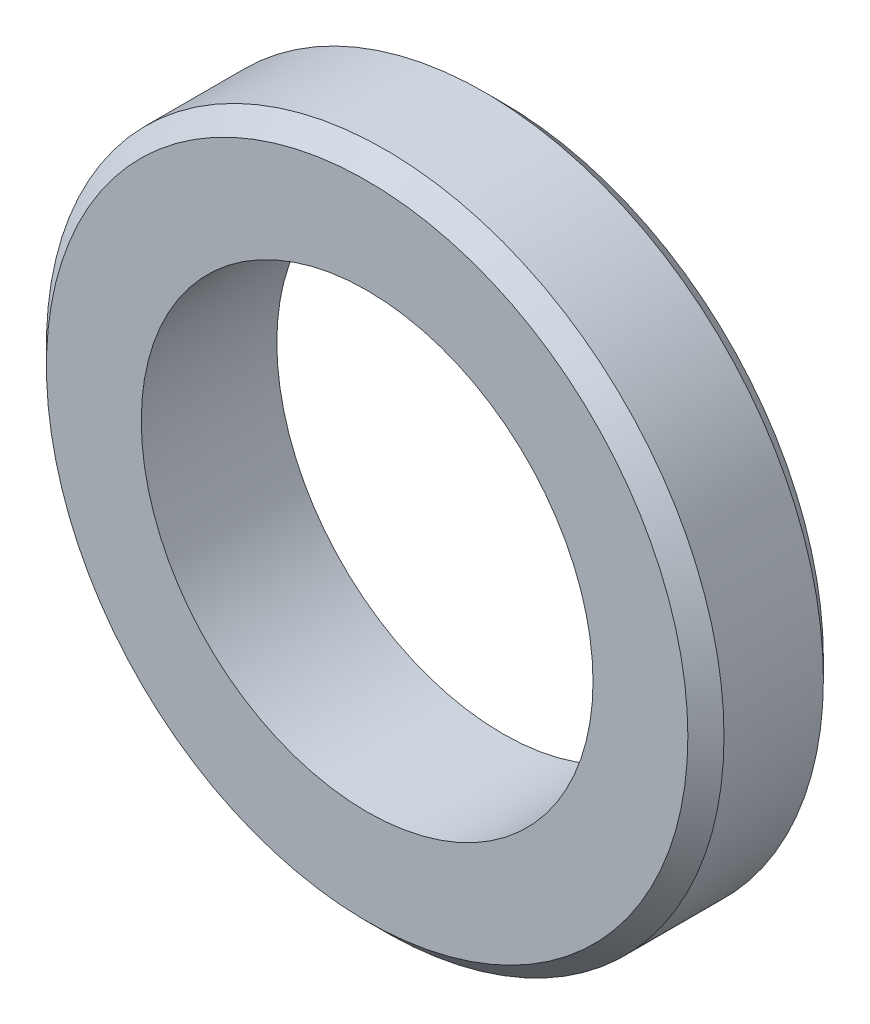
ISO-10303-21;
HEADER;
FILE_DESCRIPTION(('STEP AP214'),'2;1');
FILE_NAME('part.step','',(''),(''),'','','');
FILE_SCHEMA(('AUTOMOTIVE_DESIGN { 1 0 10303 214 1 1 1 1 }'));
ENDSEC;
DATA;
#1=APPLICATION_CONTEXT('core data for automotive mechanical design processes');
#2=APPLICATION_PROTOCOL_DEFINITION('international standard','automotive_design',2000,#1);
#3=PRODUCT_CONTEXT('',#1,'mechanical');
#4=PRODUCT('Part','Part','',(#3));
#5=PRODUCT_RELATED_PRODUCT_CATEGORY('part','',(#4));
#6=PRODUCT_DEFINITION_FORMATION('','',#4);
#7=PRODUCT_DEFINITION_CONTEXT('part definition',#1,'design');
#8=PRODUCT_DEFINITION('design','',#6,#7);
#9=PRODUCT_DEFINITION_SHAPE('','',#8);
#10=(LENGTH_UNIT() NAMED_UNIT(*) SI_UNIT(.MILLI.,.METRE.));
#11=(NAMED_UNIT(*) PLANE_ANGLE_UNIT() SI_UNIT($,.RADIAN.));
#12=(NAMED_UNIT(*) SI_UNIT($,.STERADIAN.) SOLID_ANGLE_UNIT());
#13=UNCERTAINTY_MEASURE_WITH_UNIT(LENGTH_MEASURE(1.E-05),#10,'distance_accuracy_value','');
#14=(GEOMETRIC_REPRESENTATION_CONTEXT(3) GLOBAL_UNCERTAINTY_ASSIGNED_CONTEXT((#13)) GLOBAL_UNIT_ASSIGNED_CONTEXT((#10,
#11,#12)) REPRESENTATION_CONTEXT('',''));
#15=CARTESIAN_POINT('',(0.,0.,0.));
#16=DIRECTION('',(0.,0.,1.));
#17=DIRECTION('',(1.,0.,0.));
#18=AXIS2_PLACEMENT_3D('',#15,#16,#17);
#19=CARTESIAN_POINT('',(0.,0.,3.));
#20=DIRECTION('',(0.,0.,1.));
#21=DIRECTION('',(1.,0.,0.));
#22=AXIS2_PLACEMENT_3D('',#19,#20,#21);
#23=PLANE('',#22);
#24=CARTESIAN_POINT('',(0.,0.,3.));
#25=DIRECTION('',(0.,0.,1.));
#26=DIRECTION('',(1.,0.,0.));
#27=AXIS2_PLACEMENT_3D('',#24,#25,#26);
#28=CIRCLE('',#27,7.1);
#29=CARTESIAN_POINT('',(7.1,0.,3.));
#30=VERTEX_POINT('',#29);
#31=EDGE_CURVE('E10',#30,#30,#28,.T.);
#32=ORIENTED_EDGE('',*,*,#31,.T.);
#33=EDGE_LOOP('',(#32));
#34=FACE_BOUND('',#33,.T.);
#35=CARTESIAN_POINT('',(0.,0.,3.));
#36=DIRECTION('',(0.,0.,1.));
#37=DIRECTION('',(1.,0.,0.));
#38=AXIS2_PLACEMENT_3D('',#35,#36,#37);
#39=CIRCLE('',#38,5.);
#40=CARTESIAN_POINT('',(5.,0.,3.));
#41=VERTEX_POINT('',#40);
#42=EDGE_CURVE('E69',#41,#41,#39,.T.);
#43=ORIENTED_EDGE('',*,*,#42,.F.);
#44=EDGE_LOOP('',(#43));
#45=FACE_BOUND('',#44,.T.);
#46=ADVANCED_FACE('F44',(#34,#45),#23,.T.);
#47=CARTESIAN_POINT('',(0.,0.,0.));
#48=DIRECTION('',(0.,0.,1.));
#49=DIRECTION('',(1.,0.,0.));
#50=AXIS2_PLACEMENT_3D('',#47,#48,#49);
#51=PLANE('',#50);
#52=CARTESIAN_POINT('',(0.,0.,0.));
#53=DIRECTION('',(0.,0.,1.));
#54=DIRECTION('',(1.,0.,0.));
#55=AXIS2_PLACEMENT_3D('',#52,#53,#54);
#56=CIRCLE('',#55,7.1);
#57=CARTESIAN_POINT('',(7.1,0.,0.));
#58=VERTEX_POINT('',#57);
#59=EDGE_CURVE('E53',#58,#58,#56,.F.);
#60=ORIENTED_EDGE('',*,*,#59,.T.);
#61=EDGE_LOOP('',(#60));
#62=FACE_BOUND('',#61,.T.);
#63=CARTESIAN_POINT('',(0.,0.,0.));
#64=DIRECTION('',(0.,0.,1.));
#65=DIRECTION('',(1.,0.,0.));
#66=AXIS2_PLACEMENT_3D('',#63,#64,#65);
#67=CIRCLE('',#66,5.);
#68=CARTESIAN_POINT('',(5.,0.,0.));
#69=VERTEX_POINT('',#68);
#70=EDGE_CURVE('E70',#69,#69,#67,.T.);
#71=ORIENTED_EDGE('',*,*,#70,.T.);
#72=EDGE_LOOP('',(#71));
#73=FACE_BOUND('',#72,.T.);
#74=ADVANCED_FACE('F82',(#62,#73),#51,.F.);
#75=CARTESIAN_POINT('',(0.,0.,3.));
#76=DIRECTION('',(0.,0.,-1.));
#77=DIRECTION('',(-1.,0.,0.));
#78=AXIS2_PLACEMENT_3D('',#75,#76,#77);
#79=CYLINDRICAL_SURFACE('',#78,7.5);
#80=CARTESIAN_POINT('',(0.,0.,0.399999999999998));
#81=DIRECTION('',(0.,0.,1.));
#82=DIRECTION('',(1.,0.,0.));
#83=AXIS2_PLACEMENT_3D('',#80,#81,#82);
#84=CIRCLE('',#83,7.5);
#85=CARTESIAN_POINT('',(7.5,0.,0.399999999999998));
#86=VERTEX_POINT('',#85);
#87=EDGE_CURVE('E58',#86,#86,#84,.T.);
#88=ORIENTED_EDGE('',*,*,#87,.T.);
#89=EDGE_LOOP('',(#88));
#90=FACE_BOUND('',#89,.T.);
#91=CARTESIAN_POINT('',(0.,0.,2.6));
#92=DIRECTION('',(0.,0.,1.));
#93=DIRECTION('',(1.,0.,0.));
#94=AXIS2_PLACEMENT_3D('',#91,#92,#93);
#95=CIRCLE('',#94,7.5);
#96=CARTESIAN_POINT('',(7.5,0.,2.6));
#97=VERTEX_POINT('',#96);
#98=EDGE_CURVE('E63',#97,#97,#95,.F.);
#99=ORIENTED_EDGE('',*,*,#98,.T.);
#100=EDGE_LOOP('',(#99));
#101=FACE_BOUND('',#100,.T.);
#102=ADVANCED_FACE('F88',(#90,#101),#79,.T.);
#103=CARTESIAN_POINT('',(0.,0.,3.));
#104=DIRECTION('',(0.,0.,-1.));
#105=DIRECTION('',(-1.,0.,0.));
#106=AXIS2_PLACEMENT_3D('',#103,#104,#105);
#107=CYLINDRICAL_SURFACE('',#106,5.);
#108=ORIENTED_EDGE('',*,*,#42,.T.);
#109=EDGE_LOOP('',(#108));
#110=FACE_BOUND('',#109,.T.);
#111=ORIENTED_EDGE('',*,*,#70,.F.);
#112=EDGE_LOOP('',(#111));
#113=FACE_BOUND('',#112,.T.);
#114=ADVANCED_FACE('F78',(#110,#113),#107,.F.);
#115=CARTESIAN_POINT('',(0.,0.,0.399999999999998));
#116=DIRECTION('',(0.,0.,1.));
#117=DIRECTION('',(1.,0.,0.));
#118=AXIS2_PLACEMENT_3D('',#115,#116,#117);
#119=CONICAL_SURFACE('',#118,7.5,0.78539816339745);
#120=CARTESIAN_POINT('',(7.1,0.,0.));
#121=CARTESIAN_POINT('',(7.10416666666667,0.,0.00416666666666638));
#122=CARTESIAN_POINT('',(7.10833333333333,0.,0.00833333333333312));
#123=CARTESIAN_POINT('',(7.11666666666667,0.,0.0166666666666666));
#124=CARTESIAN_POINT('',(7.12083333333333,0.,0.0208333333333333));
#125=CARTESIAN_POINT('',(7.12916666666667,0.,0.0291666666666666));
#126=CARTESIAN_POINT('',(7.13333333333333,0.,0.0333333333333331));
#127=CARTESIAN_POINT('',(7.14166666666667,0.,0.0416666666666664));
#128=CARTESIAN_POINT('',(7.14583333333333,0.,0.0458333333333332));
#129=CARTESIAN_POINT('',(7.15416666666667,0.,0.0541666666666665));
#130=CARTESIAN_POINT('',(7.15833333333333,0.,0.058333333333333));
#131=CARTESIAN_POINT('',(7.16666666666667,0.,0.0666666666666663));
#132=CARTESIAN_POINT('',(7.17083333333333,0.,0.0708333333333331));
#133=CARTESIAN_POINT('',(7.17916666666667,0.,0.0791666666666664));
#134=CARTESIAN_POINT('',(7.18333333333333,0.,0.083333333333333));
#135=CARTESIAN_POINT('',(7.19166666666667,0.,0.0916666666666662));
#136=CARTESIAN_POINT('',(7.19583333333333,0.,0.0958333333333328));
#137=CARTESIAN_POINT('',(7.20416666666667,0.,0.104166666666666));
#138=CARTESIAN_POINT('',(7.20833333333333,0.,0.108333333333333));
#139=CARTESIAN_POINT('',(7.21666666666667,0.,0.116666666666666));
#140=CARTESIAN_POINT('',(7.22083333333333,0.,0.120833333333333));
#141=CARTESIAN_POINT('',(7.22916666666667,0.,0.129166666666666));
#142=CARTESIAN_POINT('',(7.23333333333333,0.,0.133333333333333));
#143=CARTESIAN_POINT('',(7.24166666666667,0.,0.141666666666666));
#144=CARTESIAN_POINT('',(7.24583333333333,0.,0.145833333333333));
#145=CARTESIAN_POINT('',(7.25416666666667,0.,0.154166666666666));
#146=CARTESIAN_POINT('',(7.25833333333333,0.,0.158333333333333));
#147=CARTESIAN_POINT('',(7.26666666666667,0.,0.166666666666666));
#148=CARTESIAN_POINT('',(7.27083333333333,0.,0.170833333333333));
#149=CARTESIAN_POINT('',(7.27916666666667,0.,0.179166666666666));
#150=CARTESIAN_POINT('',(7.28333333333333,0.,0.183333333333332));
#151=CARTESIAN_POINT('',(7.29166666666667,0.,0.191666666666666));
#152=CARTESIAN_POINT('',(7.29583333333333,0.,0.195833333333333));
#153=CARTESIAN_POINT('',(7.30416666666667,0.,0.204166666666666));
#154=CARTESIAN_POINT('',(7.30833333333333,0.,0.208333333333333));
#155=CARTESIAN_POINT('',(7.31666666666667,0.,0.216666666666666));
#156=CARTESIAN_POINT('',(7.32083333333333,0.,0.220833333333332));
#157=CARTESIAN_POINT('',(7.32916666666667,0.,0.229166666666666));
#158=CARTESIAN_POINT('',(7.33333333333333,0.,0.233333333333332));
#159=CARTESIAN_POINT('',(7.34166666666667,0.,0.241666666666666));
#160=CARTESIAN_POINT('',(7.34583333333333,0.,0.245833333333332));
#161=CARTESIAN_POINT('',(7.35416666666667,0.,0.254166666666666));
#162=CARTESIAN_POINT('',(7.35833333333333,0.,0.258333333333332));
#163=CARTESIAN_POINT('',(7.36666666666667,0.,0.266666666666666));
#164=CARTESIAN_POINT('',(7.37083333333333,0.,0.270833333333332));
#165=CARTESIAN_POINT('',(7.37916666666667,0.,0.279166666666665));
#166=CARTESIAN_POINT('',(7.38333333333333,0.,0.283333333333332));
#167=CARTESIAN_POINT('',(7.39166666666667,0.,0.291666666666665));
#168=CARTESIAN_POINT('',(7.39583333333333,0.,0.295833333333332));
#169=CARTESIAN_POINT('',(7.40416666666667,0.,0.304166666666665));
#170=CARTESIAN_POINT('',(7.40833333333333,0.,0.308333333333332));
#171=CARTESIAN_POINT('',(7.41666666666667,0.,0.316666666666665));
#172=CARTESIAN_POINT('',(7.42083333333333,0.,0.320833333333332));
#173=CARTESIAN_POINT('',(7.42916666666667,0.,0.329166666666665));
#174=CARTESIAN_POINT('',(7.43333333333333,0.,0.333333333333332));
#175=CARTESIAN_POINT('',(7.44166666666667,0.,0.341666666666665));
#176=CARTESIAN_POINT('',(7.44583333333333,0.,0.345833333333332));
#177=CARTESIAN_POINT('',(7.45416666666667,0.,0.354166666666665));
#178=CARTESIAN_POINT('',(7.45833333333333,0.,0.358333333333332));
#179=CARTESIAN_POINT('',(7.46666666666667,0.,0.366666666666665));
#180=CARTESIAN_POINT('',(7.47083333333333,0.,0.370833333333332));
#181=CARTESIAN_POINT('',(7.47916666666667,0.,0.379166666666665));
#182=CARTESIAN_POINT('',(7.48333333333333,0.,0.383333333333332));
#183=CARTESIAN_POINT('',(7.49166666666667,0.,0.391666666666665));
#184=CARTESIAN_POINT('',(7.49583333333333,0.,0.395833333333332));
#185=CARTESIAN_POINT('',(7.5,0.,0.399999999999998));
#186=B_SPLINE_CURVE_WITH_KNOTS('',3,(#120,#121,#122,#123,#124,#125,#126,#127,#128,#129,#130,
#131,#132,#133,#134,#135,#136,#137,#138,#139,#140,#141,#142,#143,#144,#145,#146,#147,#148,#149,
#150,#151,#152,#153,#154,#155,#156,#157,#158,#159,#160,#161,#162,#163,#164,#165,#166,#167,#168,
#169,#170,#171,#172,#173,#174,#175,#176,#177,#178,#179,#180,#181,#182,#183,#184,#185),
.UNSPECIFIED.,.F.,.F.,(4,2,2,2,2,2,2,2,2,2,2,2,2,2,2,2,2,2,2,2,2,2,2,2,2,2,2,2,2,2,2,2,4),(0.,
0.0176776695296639,0.0353553390593272,0.0530330085889911,0.0707106781186544,0.0883883476483183,
0.106066017177982,0.123743686707646,0.141421356237309,0.159099025766973,0.176776695296637,
0.1944543648263,0.212132034355964,0.229809703885628,0.247487373415291,0.265165042944955,
0.282842712474618,0.300520382004282,0.318198051533946,0.335875721063609,0.353553390593273,
0.371231060122937,0.3889087296526,0.406586399182264,0.424264068711928,0.441941738241592,
0.459619407771255,0.477297077300919,0.494974746830583,0.512652416360246,0.53033008588991,
0.548007755419573,0.565685424949237),.UNSPECIFIED.);
#187=EDGE_CURVE('BSEAM95',#58,#86,#186,.T.);
#188=ORIENTED_EDGE('',*,*,#59,.F.);
#189=ORIENTED_EDGE('',*,*,#87,.F.);
#190=ORIENTED_EDGE('',*,*,#187,.T.);
#191=ORIENTED_EDGE('',*,*,#187,.F.);
#192=EDGE_LOOP('',(#188,#190,#189,#191));
#193=FACE_BOUND('',#192,.T.);
#194=ADVANCED_FACE('F95',(#193),#119,.T.);
#195=CARTESIAN_POINT('',(0.,0.,3.));
#196=DIRECTION('',(0.,0.,-1.));
#197=DIRECTION('',(-1.,0.,0.));
#198=AXIS2_PLACEMENT_3D('',#195,#196,#197);
#199=CONICAL_SURFACE('',#198,7.1,0.785398163397448);
#200=ORIENTED_EDGE('',*,*,#98,.F.);
#201=EDGE_LOOP('',(#200));
#202=FACE_BOUND('',#201,.T.);
#203=ORIENTED_EDGE('',*,*,#31,.F.);
#204=EDGE_LOOP('',(#203));
#205=FACE_BOUND('',#204,.T.);
#206=ADVANCED_FACE('F47',(#202,#205),#199,.T.);
#207=CLOSED_SHELL('',(#46,#74,#102,#114,#194,#206));
#208=MANIFOLD_SOLID_BREP('B2',#207);
#209=ADVANCED_BREP_SHAPE_REPRESENTATION('',(#18,#208),#14);
#210=SHAPE_DEFINITION_REPRESENTATION(#9,#209);
ENDSEC;
END-ISO-10303-21;
